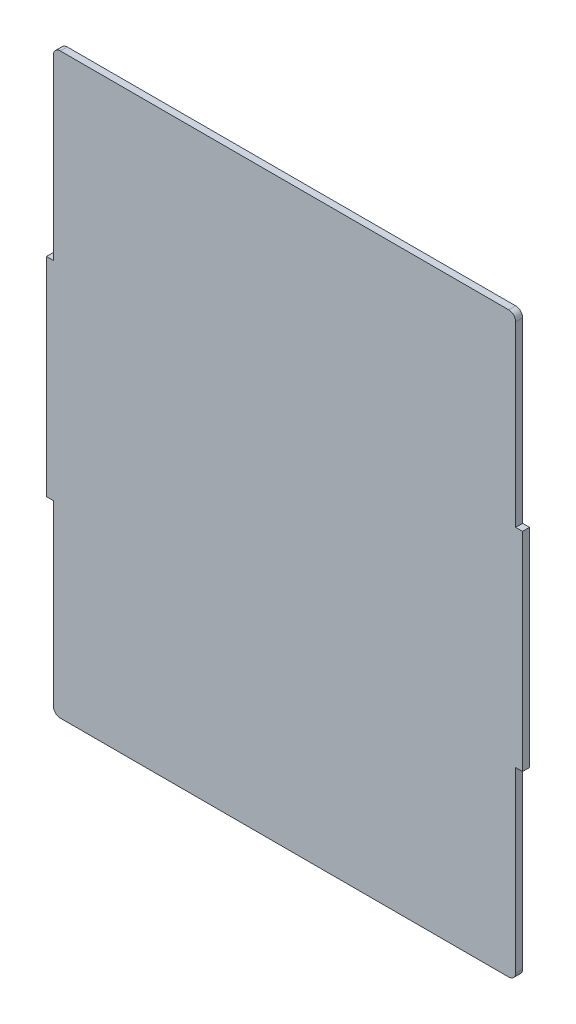
ISO-10303-21;
HEADER;
FILE_DESCRIPTION(('STEP AP214'),'2;1');
FILE_NAME('part.step','',(''),(''),'','','');
FILE_SCHEMA(('AUTOMOTIVE_DESIGN { 1 0 10303 214 1 1 1 1 }'));
ENDSEC;
DATA;
#1=APPLICATION_CONTEXT('core data for automotive mechanical design processes');
#2=APPLICATION_PROTOCOL_DEFINITION('international standard','automotive_design',2000,#1);
#3=PRODUCT_CONTEXT('',#1,'mechanical');
#4=PRODUCT('Part','Part','',(#3));
#5=PRODUCT_RELATED_PRODUCT_CATEGORY('part','',(#4));
#6=PRODUCT_DEFINITION_FORMATION('','',#4);
#7=PRODUCT_DEFINITION_CONTEXT('part definition',#1,'design');
#8=PRODUCT_DEFINITION('design','',#6,#7);
#9=PRODUCT_DEFINITION_SHAPE('','',#8);
#10=(LENGTH_UNIT() NAMED_UNIT(*) SI_UNIT(.MILLI.,.METRE.));
#11=(NAMED_UNIT(*) PLANE_ANGLE_UNIT() SI_UNIT($,.RADIAN.));
#12=(NAMED_UNIT(*) SI_UNIT($,.STERADIAN.) SOLID_ANGLE_UNIT());
#13=UNCERTAINTY_MEASURE_WITH_UNIT(LENGTH_MEASURE(1.E-05),#10,'distance_accuracy_value','');
#14=(GEOMETRIC_REPRESENTATION_CONTEXT(3) GLOBAL_UNCERTAINTY_ASSIGNED_CONTEXT((#13)) GLOBAL_UNIT_ASSIGNED_CONTEXT((#10,
#11,#12)) REPRESENTATION_CONTEXT('',''));
#15=CARTESIAN_POINT('',(0.,0.,0.));
#16=DIRECTION('',(0.,0.,1.));
#17=DIRECTION('',(1.,0.,0.));
#18=AXIS2_PLACEMENT_3D('',#15,#16,#17);
#19=CARTESIAN_POINT('',(193.,254.5,200.));
#20=DIRECTION('',(0.,0.,-1.));
#21=DIRECTION('',(-1.,0.,0.));
#22=AXIS2_PLACEMENT_3D('',#19,#20,#21);
#23=PLANE('',#22);
#24=CARTESIAN_POINT('',(96.,250.,200.));
#25=DIRECTION('',(0.,0.,1.));
#26=DIRECTION('',(1.,0.,0.));
#27=AXIS2_PLACEMENT_3D('',#24,#25,#26);
#28=CIRCLE('',#27,3.);
#29=CARTESIAN_POINT('',(96.,253.,200.));
#30=VERTEX_POINT('',#29);
#31=CARTESIAN_POINT('',(93.,250.,200.));
#32=VERTEX_POINT('',#31);
#33=EDGE_CURVE('E222',#30,#32,#28,.T.);
#34=ORIENTED_EDGE('',*,*,#33,.F.);
#35=DIRECTION('',(1.,0.,0.));
#36=VECTOR('',#35,1.);
#37=CARTESIAN_POINT('',(233.,253.,200.));
#38=LINE('',#37,#36);
#39=CARTESIAN_POINT('',(290.,253.,200.));
#40=VERTEX_POINT('',#39);
#41=EDGE_CURVE('E132',#40,#30,#38,.F.);
#42=ORIENTED_EDGE('',*,*,#41,.F.);
#43=CARTESIAN_POINT('',(290.,250.,200.));
#44=DIRECTION('',(0.,0.,-1.));
#45=DIRECTION('',(-1.,0.,0.));
#46=AXIS2_PLACEMENT_3D('',#43,#44,#45);
#47=CIRCLE('',#46,3.);
#48=CARTESIAN_POINT('',(293.,250.,200.));
#49=VERTEX_POINT('',#48);
#50=EDGE_CURVE('E19',#49,#40,#47,.F.);
#51=ORIENTED_EDGE('',*,*,#50,.F.);
#52=DIRECTION('',(0.,1.,0.));
#53=VECTOR('',#52,1.);
#54=CARTESIAN_POINT('',(293.,253.,200.));
#55=LINE('',#54,#53);
#56=CARTESIAN_POINT('',(293.,173.,200.));
#57=VERTEX_POINT('',#56);
#58=EDGE_CURVE('E131',#57,#49,#55,.T.);
#59=ORIENTED_EDGE('',*,*,#58,.F.);
#60=DIRECTION('',(1.,0.,0.));
#61=VECTOR('',#60,1.);
#62=CARTESIAN_POINT('',(293.,173.,200.));
#63=LINE('',#62,#61);
#64=CARTESIAN_POINT('',(296.,173.,200.));
#65=VERTEX_POINT('',#64);
#66=EDGE_CURVE('E142',#65,#57,#63,.F.);
#67=ORIENTED_EDGE('',*,*,#66,.F.);
#68=DIRECTION('',(0.,1.,0.));
#69=VECTOR('',#68,1.);
#70=CARTESIAN_POINT('',(296.,173.,200.));
#71=LINE('',#70,#69);
#72=CARTESIAN_POINT('',(296.,83.,200.));
#73=VERTEX_POINT('',#72);
#74=EDGE_CURVE('E158',#73,#65,#71,.T.);
#75=ORIENTED_EDGE('',*,*,#74,.F.);
#76=DIRECTION('',(1.,0.,0.));
#77=VECTOR('',#76,1.);
#78=CARTESIAN_POINT('',(296.,83.,200.));
#79=LINE('',#78,#77);
#80=CARTESIAN_POINT('',(293.,83.,200.));
#81=VERTEX_POINT('',#80);
#82=EDGE_CURVE('E163',#81,#73,#79,.T.);
#83=ORIENTED_EDGE('',*,*,#82,.F.);
#84=DIRECTION('',(0.,1.,0.));
#85=VECTOR('',#84,1.);
#86=CARTESIAN_POINT('',(293.,83.,200.));
#87=LINE('',#86,#85);
#88=CARTESIAN_POINT('',(293.,5.99999999999998,200.));
#89=VERTEX_POINT('',#88);
#90=EDGE_CURVE('E168',#89,#81,#87,.T.);
#91=ORIENTED_EDGE('',*,*,#90,.F.);
#92=CARTESIAN_POINT('',(290.,5.99999999999998,200.));
#93=DIRECTION('',(0.,0.,1.));
#94=DIRECTION('',(1.,0.,0.));
#95=AXIS2_PLACEMENT_3D('',#92,#93,#94);
#96=CIRCLE('',#95,3.);
#97=CARTESIAN_POINT('',(290.,2.99999999999998,200.));
#98=VERTEX_POINT('',#97);
#99=EDGE_CURVE('E219',#98,#89,#96,.T.);
#100=ORIENTED_EDGE('',*,*,#99,.F.);
#101=DIRECTION('',(1.,0.,0.));
#102=VECTOR('',#101,1.);
#103=CARTESIAN_POINT('',(153.,2.99999999999998,200.));
#104=LINE('',#103,#102);
#105=CARTESIAN_POINT('',(96.,2.99999999999998,200.));
#106=VERTEX_POINT('',#105);
#107=EDGE_CURVE('E173',#106,#98,#104,.T.);
#108=ORIENTED_EDGE('',*,*,#107,.F.);
#109=CARTESIAN_POINT('',(96.,5.99999999999998,200.));
#110=DIRECTION('',(0.,0.,-1.));
#111=DIRECTION('',(-1.,0.,0.));
#112=AXIS2_PLACEMENT_3D('',#109,#110,#111);
#113=CIRCLE('',#112,3.);
#114=CARTESIAN_POINT('',(93.,5.99999999999998,200.));
#115=VERTEX_POINT('',#114);
#116=EDGE_CURVE('E180',#115,#106,#113,.F.);
#117=ORIENTED_EDGE('',*,*,#116,.F.);
#118=DIRECTION('',(0.,1.,0.));
#119=VECTOR('',#118,1.);
#120=CARTESIAN_POINT('',(93.,2.99999999999997,200.));
#121=LINE('',#120,#119);
#122=CARTESIAN_POINT('',(93.,83.,200.));
#123=VERTEX_POINT('',#122);
#124=EDGE_CURVE('E177',#123,#115,#121,.F.);
#125=ORIENTED_EDGE('',*,*,#124,.F.);
#126=DIRECTION('',(1.,0.,0.));
#127=VECTOR('',#126,1.);
#128=CARTESIAN_POINT('',(93.,83.,200.));
#129=LINE('',#128,#127);
#130=CARTESIAN_POINT('',(90.,83.,200.));
#131=VERTEX_POINT('',#130);
#132=EDGE_CURVE('E184',#131,#123,#129,.T.);
#133=ORIENTED_EDGE('',*,*,#132,.F.);
#134=DIRECTION('',(0.,-1.,0.));
#135=VECTOR('',#134,1.);
#136=CARTESIAN_POINT('',(90.,83.,200.));
#137=LINE('',#136,#135);
#138=CARTESIAN_POINT('',(90.,173.,200.));
#139=VERTEX_POINT('',#138);
#140=EDGE_CURVE('E189',#139,#131,#137,.T.);
#141=ORIENTED_EDGE('',*,*,#140,.F.);
#142=DIRECTION('',(1.,0.,0.));
#143=VECTOR('',#142,1.);
#144=CARTESIAN_POINT('',(90.,173.,200.));
#145=LINE('',#144,#143);
#146=CARTESIAN_POINT('',(93.,173.,200.));
#147=VERTEX_POINT('',#146);
#148=EDGE_CURVE('E194',#147,#139,#145,.F.);
#149=ORIENTED_EDGE('',*,*,#148,.F.);
#150=DIRECTION('',(0.,1.,0.));
#151=VECTOR('',#150,1.);
#152=CARTESIAN_POINT('',(93.,173.,200.));
#153=LINE('',#152,#151);
#154=EDGE_CURVE('E199',#32,#147,#153,.F.);
#155=ORIENTED_EDGE('',*,*,#154,.F.);
#156=EDGE_LOOP('',(#34,#42,#51,#59,#67,#75,#83,#91,#100,#108,#117,#125,#133,#141,#149,#155));
#157=FACE_BOUND('',#156,.T.);
#158=ADVANCED_FACE('F16',(#157),#23,.T.);
#159=CARTESIAN_POINT('',(290.,250.,202.25));
#160=DIRECTION('',(0.,0.,-1.));
#161=DIRECTION('',(-1.,0.,0.));
#162=AXIS2_PLACEMENT_3D('',#159,#160,#161);
#163=CYLINDRICAL_SURFACE('',#162,3.);
#164=CARTESIAN_POINT('',(290.,250.,203.));
#165=DIRECTION('',(0.,0.,-1.));
#166=DIRECTION('',(-1.,0.,0.));
#167=AXIS2_PLACEMENT_3D('',#164,#165,#166);
#168=CIRCLE('',#167,3.);
#169=CARTESIAN_POINT('',(293.,250.,203.));
#170=VERTEX_POINT('',#169);
#171=CARTESIAN_POINT('',(290.,253.,203.));
#172=VERTEX_POINT('',#171);
#173=EDGE_CURVE('E140',#170,#172,#168,.F.);
#174=ORIENTED_EDGE('',*,*,#173,.F.);
#175=DIRECTION('',(0.,0.,-1.));
#176=VECTOR('',#175,1.);
#177=CARTESIAN_POINT('',(293.,250.,203.));
#178=LINE('',#177,#176);
#179=EDGE_CURVE('E137',#49,#170,#178,.F.);
#180=ORIENTED_EDGE('',*,*,#179,.F.);
#181=ORIENTED_EDGE('',*,*,#50,.T.);
#182=DIRECTION('',(0.,0.,1.));
#183=VECTOR('',#182,1.);
#184=CARTESIAN_POINT('',(290.,253.,201.5));
#185=LINE('',#184,#183);
#186=EDGE_CURVE('E135',#172,#40,#185,.F.);
#187=ORIENTED_EDGE('',*,*,#186,.F.);
#188=EDGE_LOOP('',(#174,#180,#181,#187));
#189=FACE_BOUND('',#188,.T.);
#190=ADVANCED_FACE('F138',(#189),#163,.T.);
#191=CARTESIAN_POINT('',(233.,253.,201.5));
#192=DIRECTION('',(0.,1.,0.));
#193=DIRECTION('',(0.,0.,1.));
#194=AXIS2_PLACEMENT_3D('',#191,#192,#193);
#195=PLANE('',#194);
#196=DIRECTION('',(0.,0.,1.));
#197=VECTOR('',#196,1.);
#198=CARTESIAN_POINT('',(96.,253.,202.25));
#199=LINE('',#198,#197);
#200=CARTESIAN_POINT('',(96.,253.,203.));
#201=VERTEX_POINT('',#200);
#202=EDGE_CURVE('E205',#201,#30,#199,.F.);
#203=ORIENTED_EDGE('',*,*,#202,.F.);
#204=DIRECTION('',(1.,0.,0.));
#205=VECTOR('',#204,1.);
#206=CARTESIAN_POINT('',(193.,253.,203.));
#207=LINE('',#206,#205);
#208=EDGE_CURVE('E146',#172,#201,#207,.F.);
#209=ORIENTED_EDGE('',*,*,#208,.F.);
#210=ORIENTED_EDGE('',*,*,#186,.T.);
#211=ORIENTED_EDGE('',*,*,#41,.T.);
#212=EDGE_LOOP('',(#203,#209,#210,#211));
#213=FACE_BOUND('',#212,.T.);
#214=ADVANCED_FACE('F362',(#213),#195,.T.);
#215=CARTESIAN_POINT('',(96.,250.,202.25));
#216=DIRECTION('',(0.,0.,1.));
#217=DIRECTION('',(1.,0.,0.));
#218=AXIS2_PLACEMENT_3D('',#215,#216,#217);
#219=CYLINDRICAL_SURFACE('',#218,3.);
#220=ORIENTED_EDGE('',*,*,#33,.T.);
#221=DIRECTION('',(0.,0.,1.));
#222=VECTOR('',#221,1.);
#223=CARTESIAN_POINT('',(93.,250.,203.));
#224=LINE('',#223,#222);
#225=CARTESIAN_POINT('',(93.,250.,203.));
#226=VERTEX_POINT('',#225);
#227=EDGE_CURVE('E201',#226,#32,#224,.F.);
#228=ORIENTED_EDGE('',*,*,#227,.F.);
#229=CARTESIAN_POINT('',(96.,250.,203.));
#230=DIRECTION('',(0.,0.,1.));
#231=DIRECTION('',(1.,0.,0.));
#232=AXIS2_PLACEMENT_3D('',#229,#230,#231);
#233=CIRCLE('',#232,3.);
#234=EDGE_CURVE('E215',#201,#226,#233,.T.);
#235=ORIENTED_EDGE('',*,*,#234,.F.);
#236=ORIENTED_EDGE('',*,*,#202,.T.);
#237=EDGE_LOOP('',(#220,#228,#235,#236));
#238=FACE_BOUND('',#237,.T.);
#239=ADVANCED_FACE('F359',(#238),#219,.T.);
#240=CARTESIAN_POINT('',(93.,173.,203.));
#241=DIRECTION('',(-1.,0.,0.));
#242=DIRECTION('',(0.,0.,1.));
#243=AXIS2_PLACEMENT_3D('',#240,#241,#242);
#244=PLANE('',#243);
#245=DIRECTION('',(0.,0.,1.));
#246=VECTOR('',#245,1.);
#247=CARTESIAN_POINT('',(93.,173.,203.));
#248=LINE('',#247,#246);
#249=CARTESIAN_POINT('',(93.,173.,203.));
#250=VERTEX_POINT('',#249);
#251=EDGE_CURVE('E196',#250,#147,#248,.F.);
#252=ORIENTED_EDGE('',*,*,#251,.F.);
#253=DIRECTION('',(0.,-1.,0.));
#254=VECTOR('',#253,1.);
#255=CARTESIAN_POINT('',(93.,254.5,203.));
#256=LINE('',#255,#254);
#257=EDGE_CURVE('E217',#226,#250,#256,.T.);
#258=ORIENTED_EDGE('',*,*,#257,.F.);
#259=ORIENTED_EDGE('',*,*,#227,.T.);
#260=ORIENTED_EDGE('',*,*,#154,.T.);
#261=EDGE_LOOP('',(#252,#258,#259,#260));
#262=FACE_BOUND('',#261,.T.);
#263=ADVANCED_FACE('F358',(#262),#244,.T.);
#264=CARTESIAN_POINT('',(90.,173.,203.));
#265=DIRECTION('',(0.,1.,0.));
#266=DIRECTION('',(0.,0.,1.));
#267=AXIS2_PLACEMENT_3D('',#264,#265,#266);
#268=PLANE('',#267);
#269=ORIENTED_EDGE('',*,*,#148,.T.);
#270=DIRECTION('',(0.,0.,1.));
#271=VECTOR('',#270,1.);
#272=CARTESIAN_POINT('',(90.,173.,203.));
#273=LINE('',#272,#271);
#274=CARTESIAN_POINT('',(90.,173.,203.));
#275=VERTEX_POINT('',#274);
#276=EDGE_CURVE('E191',#275,#139,#273,.F.);
#277=ORIENTED_EDGE('',*,*,#276,.F.);
#278=DIRECTION('',(1.,0.,0.));
#279=VECTOR('',#278,1.);
#280=CARTESIAN_POINT('',(193.,173.,203.));
#281=LINE('',#280,#279);
#282=EDGE_CURVE('E236',#250,#275,#281,.F.);
#283=ORIENTED_EDGE('',*,*,#282,.F.);
#284=ORIENTED_EDGE('',*,*,#251,.T.);
#285=EDGE_LOOP('',(#269,#277,#283,#284));
#286=FACE_BOUND('',#285,.T.);
#287=ADVANCED_FACE('F355',(#286),#268,.T.);
#288=CARTESIAN_POINT('',(90.,83.,203.));
#289=DIRECTION('',(-1.,0.,0.));
#290=DIRECTION('',(0.,-1.,0.));
#291=AXIS2_PLACEMENT_3D('',#288,#289,#290);
#292=PLANE('',#291);
#293=ORIENTED_EDGE('',*,*,#140,.T.);
#294=DIRECTION('',(0.,0.,-1.));
#295=VECTOR('',#294,1.);
#296=CARTESIAN_POINT('',(90.,83.,203.));
#297=LINE('',#296,#295);
#298=CARTESIAN_POINT('',(90.,83.,203.));
#299=VERTEX_POINT('',#298);
#300=EDGE_CURVE('E186',#299,#131,#297,.T.);
#301=ORIENTED_EDGE('',*,*,#300,.F.);
#302=DIRECTION('',(0.,-1.,0.));
#303=VECTOR('',#302,1.);
#304=CARTESIAN_POINT('',(90.,254.5,203.));
#305=LINE('',#304,#303);
#306=EDGE_CURVE('E239',#275,#299,#305,.T.);
#307=ORIENTED_EDGE('',*,*,#306,.F.);
#308=ORIENTED_EDGE('',*,*,#276,.T.);
#309=EDGE_LOOP('',(#293,#301,#307,#308));
#310=FACE_BOUND('',#309,.T.);
#311=ADVANCED_FACE('F352',(#310),#292,.T.);
#312=CARTESIAN_POINT('',(93.,83.,203.));
#313=DIRECTION('',(0.,-1.,0.));
#314=DIRECTION('',(0.,0.,-1.));
#315=AXIS2_PLACEMENT_3D('',#312,#313,#314);
#316=PLANE('',#315);
#317=ORIENTED_EDGE('',*,*,#132,.T.);
#318=DIRECTION('',(0.,0.,1.));
#319=VECTOR('',#318,1.);
#320=CARTESIAN_POINT('',(93.,83.,203.));
#321=LINE('',#320,#319);
#322=CARTESIAN_POINT('',(93.,83.,203.));
#323=VERTEX_POINT('',#322);
#324=EDGE_CURVE('E181',#323,#123,#321,.F.);
#325=ORIENTED_EDGE('',*,*,#324,.F.);
#326=DIRECTION('',(1.,0.,0.));
#327=VECTOR('',#326,1.);
#328=CARTESIAN_POINT('',(193.,83.,203.));
#329=LINE('',#328,#327);
#330=EDGE_CURVE('E248',#299,#323,#329,.T.);
#331=ORIENTED_EDGE('',*,*,#330,.F.);
#332=ORIENTED_EDGE('',*,*,#300,.T.);
#333=EDGE_LOOP('',(#317,#325,#331,#332));
#334=FACE_BOUND('',#333,.T.);
#335=ADVANCED_FACE('F347',(#334),#316,.T.);
#336=CARTESIAN_POINT('',(93.,2.99999999999997,203.));
#337=DIRECTION('',(-1.,0.,0.));
#338=DIRECTION('',(0.,0.,1.));
#339=AXIS2_PLACEMENT_3D('',#336,#337,#338);
#340=PLANE('',#339);
#341=ORIENTED_EDGE('',*,*,#324,.T.);
#342=ORIENTED_EDGE('',*,*,#124,.T.);
#343=DIRECTION('',(0.,0.,-1.));
#344=VECTOR('',#343,1.);
#345=CARTESIAN_POINT('',(93.,5.99999999999998,202.25));
#346=LINE('',#345,#344);
#347=CARTESIAN_POINT('',(93.,5.99999999999998,203.));
#348=VERTEX_POINT('',#347);
#349=EDGE_CURVE('E221',#348,#115,#346,.T.);
#350=ORIENTED_EDGE('',*,*,#349,.F.);
#351=DIRECTION('',(0.,-1.,0.));
#352=VECTOR('',#351,1.);
#353=CARTESIAN_POINT('',(93.,254.5,203.));
#354=LINE('',#353,#352);
#355=EDGE_CURVE('E214',#323,#348,#354,.T.);
#356=ORIENTED_EDGE('',*,*,#355,.F.);
#357=EDGE_LOOP('',(#341,#342,#350,#356));
#358=FACE_BOUND('',#357,.T.);
#359=ADVANCED_FACE('F343',(#358),#340,.T.);
#360=CARTESIAN_POINT('',(96.,5.99999999999998,202.25));
#361=DIRECTION('',(0.,0.,-1.));
#362=DIRECTION('',(-1.,0.,0.));
#363=AXIS2_PLACEMENT_3D('',#360,#361,#362);
#364=CYLINDRICAL_SURFACE('',#363,3.);
#365=CARTESIAN_POINT('',(96.,5.99999999999998,203.));
#366=DIRECTION('',(0.,0.,-1.));
#367=DIRECTION('',(-1.,0.,0.));
#368=AXIS2_PLACEMENT_3D('',#365,#366,#367);
#369=CIRCLE('',#368,3.);
#370=CARTESIAN_POINT('',(96.,3.,203.));
#371=VERTEX_POINT('',#370);
#372=EDGE_CURVE('E211',#348,#371,#369,.F.);
#373=ORIENTED_EDGE('',*,*,#372,.F.);
#374=ORIENTED_EDGE('',*,*,#349,.T.);
#375=ORIENTED_EDGE('',*,*,#116,.T.);
#376=DIRECTION('',(0.,0.,-1.));
#377=VECTOR('',#376,1.);
#378=CARTESIAN_POINT('',(96.,2.99999999999998,201.5));
#379=LINE('',#378,#377);
#380=EDGE_CURVE('E176',#371,#106,#379,.T.);
#381=ORIENTED_EDGE('',*,*,#380,.F.);
#382=EDGE_LOOP('',(#373,#374,#375,#381));
#383=FACE_BOUND('',#382,.T.);
#384=ADVANCED_FACE('F339',(#383),#364,.T.);
#385=CARTESIAN_POINT('',(153.,2.99999999999998,201.5));
#386=DIRECTION('',(0.,-1.,0.));
#387=DIRECTION('',(0.,0.,-1.));
#388=AXIS2_PLACEMENT_3D('',#385,#386,#387);
#389=PLANE('',#388);
#390=ORIENTED_EDGE('',*,*,#380,.T.);
#391=ORIENTED_EDGE('',*,*,#107,.T.);
#392=DIRECTION('',(0.,0.,1.));
#393=VECTOR('',#392,1.);
#394=CARTESIAN_POINT('',(290.,2.99999999999998,202.25));
#395=LINE('',#394,#393);
#396=CARTESIAN_POINT('',(290.,2.99999999999999,203.));
#397=VERTEX_POINT('',#396);
#398=EDGE_CURVE('E175',#397,#98,#395,.F.);
#399=ORIENTED_EDGE('',*,*,#398,.F.);
#400=DIRECTION('',(1.,0.,0.));
#401=VECTOR('',#400,1.);
#402=CARTESIAN_POINT('',(193.,3.,203.));
#403=LINE('',#402,#401);
#404=EDGE_CURVE('E210',#371,#397,#403,.T.);
#405=ORIENTED_EDGE('',*,*,#404,.F.);
#406=EDGE_LOOP('',(#390,#391,#399,#405));
#407=FACE_BOUND('',#406,.T.);
#408=ADVANCED_FACE('F336',(#407),#389,.T.);
#409=CARTESIAN_POINT('',(290.,5.99999999999998,202.25));
#410=DIRECTION('',(0.,0.,1.));
#411=DIRECTION('',(1.,0.,0.));
#412=AXIS2_PLACEMENT_3D('',#409,#410,#411);
#413=CYLINDRICAL_SURFACE('',#412,3.);
#414=ORIENTED_EDGE('',*,*,#99,.T.);
#415=DIRECTION('',(0.,0.,-1.));
#416=VECTOR('',#415,1.);
#417=CARTESIAN_POINT('',(293.,5.99999999999998,203.));
#418=LINE('',#417,#416);
#419=CARTESIAN_POINT('',(293.,5.99999999999998,203.));
#420=VERTEX_POINT('',#419);
#421=EDGE_CURVE('E170',#420,#89,#418,.T.);
#422=ORIENTED_EDGE('',*,*,#421,.F.);
#423=CARTESIAN_POINT('',(290.,5.99999999999998,203.));
#424=DIRECTION('',(0.,0.,1.));
#425=DIRECTION('',(1.,0.,0.));
#426=AXIS2_PLACEMENT_3D('',#423,#424,#425);
#427=CIRCLE('',#426,3.);
#428=EDGE_CURVE('E206',#397,#420,#427,.T.);
#429=ORIENTED_EDGE('',*,*,#428,.F.);
#430=ORIENTED_EDGE('',*,*,#398,.T.);
#431=EDGE_LOOP('',(#414,#422,#429,#430));
#432=FACE_BOUND('',#431,.T.);
#433=ADVANCED_FACE('F333',(#432),#413,.T.);
#434=CARTESIAN_POINT('',(293.,83.,203.));
#435=DIRECTION('',(1.,0.,0.));
#436=DIRECTION('',(0.,0.,-1.));
#437=AXIS2_PLACEMENT_3D('',#434,#435,#436);
#438=PLANE('',#437);
#439=DIRECTION('',(0.,0.,-1.));
#440=VECTOR('',#439,1.);
#441=CARTESIAN_POINT('',(293.,83.,203.));
#442=LINE('',#441,#440);
#443=CARTESIAN_POINT('',(293.,83.,203.));
#444=VERTEX_POINT('',#443);
#445=EDGE_CURVE('E165',#444,#81,#442,.T.);
#446=ORIENTED_EDGE('',*,*,#445,.F.);
#447=DIRECTION('',(0.,-1.,0.));
#448=VECTOR('',#447,1.);
#449=CARTESIAN_POINT('',(293.,254.5,203.));
#450=LINE('',#449,#448);
#451=EDGE_CURVE('E209',#420,#444,#450,.F.);
#452=ORIENTED_EDGE('',*,*,#451,.F.);
#453=ORIENTED_EDGE('',*,*,#421,.T.);
#454=ORIENTED_EDGE('',*,*,#90,.T.);
#455=EDGE_LOOP('',(#446,#452,#453,#454));
#456=FACE_BOUND('',#455,.T.);
#457=ADVANCED_FACE('F320',(#456),#438,.T.);
#458=CARTESIAN_POINT('',(296.,83.,203.));
#459=DIRECTION('',(0.,-1.,0.));
#460=DIRECTION('',(0.,0.,-1.));
#461=AXIS2_PLACEMENT_3D('',#458,#459,#460);
#462=PLANE('',#461);
#463=ORIENTED_EDGE('',*,*,#82,.T.);
#464=DIRECTION('',(0.,0.,-1.));
#465=VECTOR('',#464,1.);
#466=CARTESIAN_POINT('',(296.,83.,203.));
#467=LINE('',#466,#465);
#468=CARTESIAN_POINT('',(296.,83.,203.));
#469=VERTEX_POINT('',#468);
#470=EDGE_CURVE('E160',#469,#73,#467,.T.);
#471=ORIENTED_EDGE('',*,*,#470,.F.);
#472=DIRECTION('',(1.,0.,0.));
#473=VECTOR('',#472,1.);
#474=CARTESIAN_POINT('',(193.,83.,203.));
#475=LINE('',#474,#473);
#476=EDGE_CURVE('E275',#444,#469,#475,.T.);
#477=ORIENTED_EDGE('',*,*,#476,.F.);
#478=ORIENTED_EDGE('',*,*,#445,.T.);
#479=EDGE_LOOP('',(#463,#471,#477,#478));
#480=FACE_BOUND('',#479,.T.);
#481=ADVANCED_FACE('F324',(#480),#462,.T.);
#482=CARTESIAN_POINT('',(296.,173.,203.));
#483=DIRECTION('',(1.,0.,0.));
#484=DIRECTION('',(0.,0.,-1.));
#485=AXIS2_PLACEMENT_3D('',#482,#483,#484);
#486=PLANE('',#485);
#487=ORIENTED_EDGE('',*,*,#74,.T.);
#488=DIRECTION('',(0.,0.,1.));
#489=VECTOR('',#488,1.);
#490=CARTESIAN_POINT('',(296.,173.,203.));
#491=LINE('',#490,#489);
#492=CARTESIAN_POINT('',(296.,173.,203.));
#493=VERTEX_POINT('',#492);
#494=EDGE_CURVE('E155',#493,#65,#491,.F.);
#495=ORIENTED_EDGE('',*,*,#494,.F.);
#496=DIRECTION('',(0.,-1.,0.));
#497=VECTOR('',#496,1.);
#498=CARTESIAN_POINT('',(296.,254.5,203.));
#499=LINE('',#498,#497);
#500=EDGE_CURVE('E278',#469,#493,#499,.F.);
#501=ORIENTED_EDGE('',*,*,#500,.F.);
#502=ORIENTED_EDGE('',*,*,#470,.T.);
#503=EDGE_LOOP('',(#487,#495,#501,#502));
#504=FACE_BOUND('',#503,.T.);
#505=ADVANCED_FACE('F328',(#504),#486,.T.);
#506=CARTESIAN_POINT('',(293.,173.,203.));
#507=DIRECTION('',(0.,1.,0.));
#508=DIRECTION('',(0.,0.,1.));
#509=AXIS2_PLACEMENT_3D('',#506,#507,#508);
#510=PLANE('',#509);
#511=ORIENTED_EDGE('',*,*,#66,.T.);
#512=DIRECTION('',(0.,0.,-1.));
#513=VECTOR('',#512,1.);
#514=CARTESIAN_POINT('',(293.,173.,203.));
#515=LINE('',#514,#513);
#516=CARTESIAN_POINT('',(293.,173.,203.));
#517=VERTEX_POINT('',#516);
#518=EDGE_CURVE('E34',#517,#57,#515,.T.);
#519=ORIENTED_EDGE('',*,*,#518,.F.);
#520=DIRECTION('',(1.,0.,0.));
#521=VECTOR('',#520,1.);
#522=CARTESIAN_POINT('',(193.,173.,203.));
#523=LINE('',#522,#521);
#524=EDGE_CURVE('E25',#493,#517,#523,.F.);
#525=ORIENTED_EDGE('',*,*,#524,.F.);
#526=ORIENTED_EDGE('',*,*,#494,.T.);
#527=EDGE_LOOP('',(#511,#519,#525,#526));
#528=FACE_BOUND('',#527,.T.);
#529=ADVANCED_FACE('F329',(#528),#510,.T.);
#530=CARTESIAN_POINT('',(293.,253.,203.));
#531=DIRECTION('',(1.,0.,0.));
#532=DIRECTION('',(0.,0.,-1.));
#533=AXIS2_PLACEMENT_3D('',#530,#531,#532);
#534=PLANE('',#533);
#535=ORIENTED_EDGE('',*,*,#518,.T.);
#536=ORIENTED_EDGE('',*,*,#58,.T.);
#537=ORIENTED_EDGE('',*,*,#179,.T.);
#538=DIRECTION('',(0.,-1.,0.));
#539=VECTOR('',#538,1.);
#540=CARTESIAN_POINT('',(293.,254.5,203.));
#541=LINE('',#540,#539);
#542=EDGE_CURVE('E10',#517,#170,#541,.F.);
#543=ORIENTED_EDGE('',*,*,#542,.F.);
#544=EDGE_LOOP('',(#535,#536,#537,#543));
#545=FACE_BOUND('',#544,.T.);
#546=ADVANCED_FACE('F144',(#545),#534,.T.);
#547=CARTESIAN_POINT('',(193.,254.5,203.));
#548=DIRECTION('',(0.,0.,1.));
#549=DIRECTION('',(0.,-1.,0.));
#550=AXIS2_PLACEMENT_3D('',#547,#548,#549);
#551=PLANE('',#550);
#552=ORIENTED_EDGE('',*,*,#524,.T.);
#553=ORIENTED_EDGE('',*,*,#542,.T.);
#554=ORIENTED_EDGE('',*,*,#173,.T.);
#555=ORIENTED_EDGE('',*,*,#208,.T.);
#556=ORIENTED_EDGE('',*,*,#234,.T.);
#557=ORIENTED_EDGE('',*,*,#257,.T.);
#558=ORIENTED_EDGE('',*,*,#282,.T.);
#559=ORIENTED_EDGE('',*,*,#306,.T.);
#560=ORIENTED_EDGE('',*,*,#330,.T.);
#561=ORIENTED_EDGE('',*,*,#355,.T.);
#562=ORIENTED_EDGE('',*,*,#372,.T.);
#563=ORIENTED_EDGE('',*,*,#404,.T.);
#564=ORIENTED_EDGE('',*,*,#428,.T.);
#565=ORIENTED_EDGE('',*,*,#451,.T.);
#566=ORIENTED_EDGE('',*,*,#476,.T.);
#567=ORIENTED_EDGE('',*,*,#500,.T.);
#568=EDGE_LOOP('',(#552,#553,#554,#555,#556,#557,#558,#559,#560,#561,#562,#563,#564,#565,#566,#567));
#569=FACE_BOUND('',#568,.T.);
#570=ADVANCED_FACE('F316',(#569),#551,.T.);
#571=CLOSED_SHELL('',(#158,#190,#214,#239,#263,#287,#311,#335,#359,#384,#408,#433,#457,#481,
#505,#529,#546,#570));
#572=MANIFOLD_SOLID_BREP('B1',#571);
#573=ADVANCED_BREP_SHAPE_REPRESENTATION('',(#18,#572),#14);
#574=SHAPE_DEFINITION_REPRESENTATION(#9,#573);
ENDSEC;
END-ISO-10303-21;
